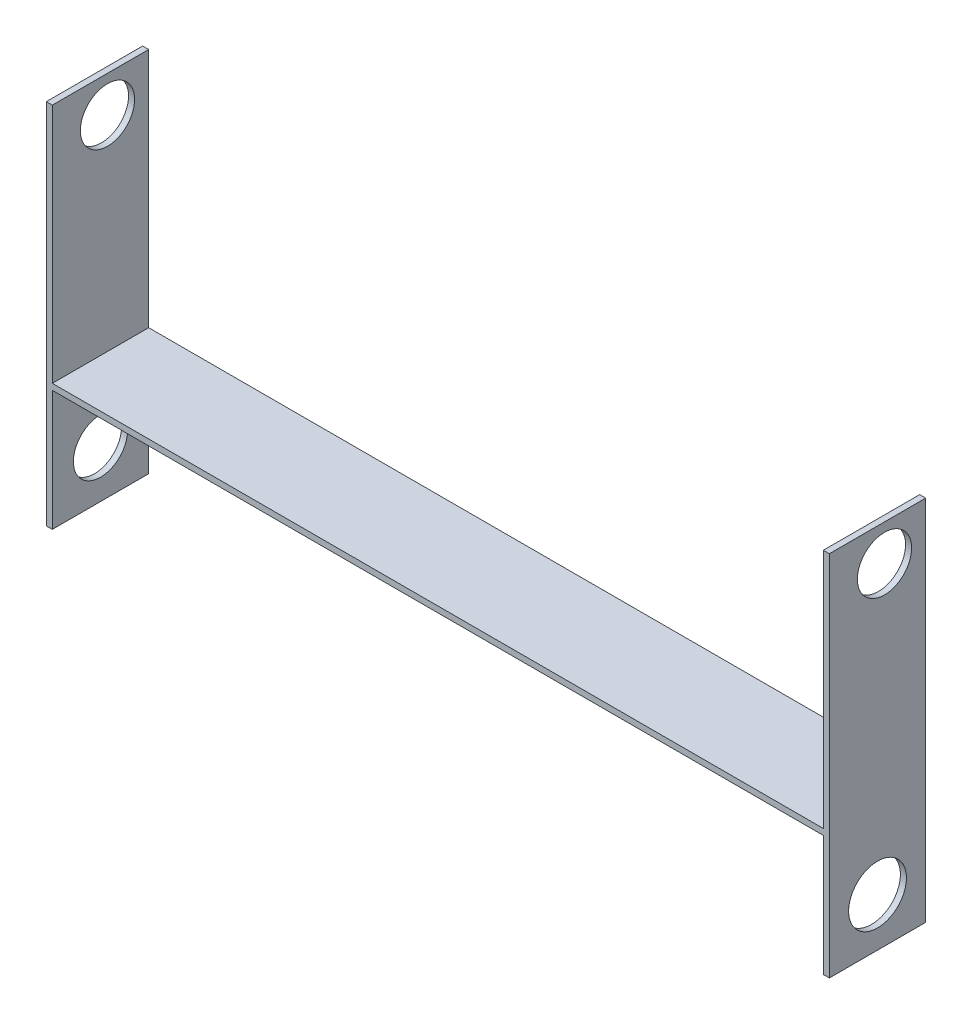
ISO-10303-21;
HEADER;
FILE_DESCRIPTION(('STEP AP214'),'2;1');
FILE_NAME('part.step','',(''),(''),'','','');
FILE_SCHEMA(('AUTOMOTIVE_DESIGN { 1 0 10303 214 1 1 1 1 }'));
ENDSEC;
DATA;
#1=APPLICATION_CONTEXT('core data for automotive mechanical design processes');
#2=APPLICATION_PROTOCOL_DEFINITION('international standard','automotive_design',2000,#1);
#3=PRODUCT_CONTEXT('',#1,'mechanical');
#4=PRODUCT('Part','Part','',(#3));
#5=PRODUCT_RELATED_PRODUCT_CATEGORY('part','',(#4));
#6=PRODUCT_DEFINITION_FORMATION('','',#4);
#7=PRODUCT_DEFINITION_CONTEXT('part definition',#1,'design');
#8=PRODUCT_DEFINITION('design','',#6,#7);
#9=PRODUCT_DEFINITION_SHAPE('','',#8);
#10=(LENGTH_UNIT() NAMED_UNIT(*) SI_UNIT(.MILLI.,.METRE.));
#11=(NAMED_UNIT(*) PLANE_ANGLE_UNIT() SI_UNIT($,.RADIAN.));
#12=(NAMED_UNIT(*) SI_UNIT($,.STERADIAN.) SOLID_ANGLE_UNIT());
#13=UNCERTAINTY_MEASURE_WITH_UNIT(LENGTH_MEASURE(1.E-05),#10,'distance_accuracy_value','');
#14=(GEOMETRIC_REPRESENTATION_CONTEXT(3) GLOBAL_UNCERTAINTY_ASSIGNED_CONTEXT((#13)) GLOBAL_UNIT_ASSIGNED_CONTEXT((#10,
#11,#12)) REPRESENTATION_CONTEXT('',''));
#15=CARTESIAN_POINT('',(0.,0.,0.));
#16=DIRECTION('',(0.,0.,1.));
#17=DIRECTION('',(1.,0.,0.));
#18=AXIS2_PLACEMENT_3D('',#15,#16,#17);
#19=CARTESIAN_POINT('',(-412.75,0.,50.8));
#20=DIRECTION('',(0.,1.,0.));
#21=DIRECTION('',(0.,0.,1.));
#22=AXIS2_PLACEMENT_3D('',#19,#20,#21);
#23=PLANE('',#22);
#24=DIRECTION('',(1.,0.,0.));
#25=VECTOR('',#24,1.);
#26=CARTESIAN_POINT('',(-412.75,0.,0.));
#27=LINE('',#26,#25);
#28=CARTESIAN_POINT('',(-409.575,0.,0.));
#29=VERTEX_POINT('',#28);
#30=CARTESIAN_POINT('',(-3.17500000000009,0.,0.));
#31=VERTEX_POINT('',#30);
#32=EDGE_CURVE('E52',#29,#31,#27,.T.);
#33=ORIENTED_EDGE('',*,*,#32,.T.);
#34=DIRECTION('',(0.,0.,1.));
#35=VECTOR('',#34,1.);
#36=CARTESIAN_POINT('',(-3.175,0.,50.8));
#37=LINE('',#36,#35);
#38=CARTESIAN_POINT('',(-3.17500000000009,0.,50.8));
#39=VERTEX_POINT('',#38);
#40=EDGE_CURVE('E47',#31,#39,#37,.T.);
#41=ORIENTED_EDGE('',*,*,#40,.T.);
#42=DIRECTION('',(1.,0.,0.));
#43=VECTOR('',#42,1.);
#44=CARTESIAN_POINT('',(-412.75,0.,50.8));
#45=LINE('',#44,#43);
#46=CARTESIAN_POINT('',(-409.575,0.,50.8));
#47=VERTEX_POINT('',#46);
#48=EDGE_CURVE('E142',#47,#39,#45,.T.);
#49=ORIENTED_EDGE('',*,*,#48,.F.);
#50=DIRECTION('',(0.,0.,-1.));
#51=VECTOR('',#50,1.);
#52=CARTESIAN_POINT('',(-409.575,0.,0.));
#53=LINE('',#52,#51);
#54=EDGE_CURVE('E166',#47,#29,#53,.T.);
#55=ORIENTED_EDGE('',*,*,#54,.T.);
#56=EDGE_LOOP('',(#33,#41,#49,#55));
#57=FACE_BOUND('',#56,.T.);
#58=ADVANCED_FACE('F32',(#57),#23,.F.);
#59=CARTESIAN_POINT('',(0.,0.,50.8));
#60=DIRECTION('',(-1.,0.,0.));
#61=DIRECTION('',(0.,0.,1.));
#62=AXIS2_PLACEMENT_3D('',#59,#60,#61);
#63=PLANE('',#62);
#64=CARTESIAN_POINT('',(0.,111.125,21.7297));
#65=DIRECTION('',(1.,0.,0.));
#66=DIRECTION('',(0.,0.,-1.));
#67=AXIS2_PLACEMENT_3D('',#64,#65,#66);
#68=CIRCLE('',#67,14.2875);
#69=CARTESIAN_POINT('',(0.,111.125,7.44220000000001));
#70=VERTEX_POINT('',#69);
#71=EDGE_CURVE('E316',#70,#70,#68,.T.);
#72=ORIENTED_EDGE('',*,*,#71,.F.);
#73=EDGE_LOOP('',(#72));
#74=FACE_BOUND('',#73,.T.);
#75=DIRECTION('',(0.,1.,0.));
#76=VECTOR('',#75,1.);
#77=CARTESIAN_POINT('',(0.,0.,0.));
#78=LINE('',#77,#76);
#79=CARTESIAN_POINT('',(0.,-63.5,0.));
#80=VERTEX_POINT('',#79);
#81=CARTESIAN_POINT('',(0.,130.175,0.));
#82=VERTEX_POINT('',#81);
#83=EDGE_CURVE('E194',#80,#82,#78,.T.);
#84=ORIENTED_EDGE('',*,*,#83,.T.);
#85=DIRECTION('',(0.,0.,-1.));
#86=VECTOR('',#85,1.);
#87=CARTESIAN_POINT('',(0.,130.175,50.8));
#88=LINE('',#87,#86);
#89=CARTESIAN_POINT('',(0.,130.175,50.8));
#90=VERTEX_POINT('',#89);
#91=EDGE_CURVE('E11',#90,#82,#88,.T.);
#92=ORIENTED_EDGE('',*,*,#91,.F.);
#93=DIRECTION('',(0.,1.,0.));
#94=VECTOR('',#93,1.);
#95=CARTESIAN_POINT('',(0.,0.,50.8));
#96=LINE('',#95,#94);
#97=CARTESIAN_POINT('',(0.,-63.5,50.8));
#98=VERTEX_POINT('',#97);
#99=EDGE_CURVE('E177',#98,#90,#96,.T.);
#100=ORIENTED_EDGE('',*,*,#99,.F.);
#101=DIRECTION('',(0.,0.,-1.));
#102=VECTOR('',#101,1.);
#103=CARTESIAN_POINT('',(0.,-63.5,0.));
#104=LINE('',#103,#102);
#105=EDGE_CURVE('E129',#98,#80,#104,.T.);
#106=ORIENTED_EDGE('',*,*,#105,.T.);
#107=EDGE_LOOP('',(#84,#92,#100,#106));
#108=FACE_BOUND('',#107,.T.);
#109=CARTESIAN_POINT('',(0.,-38.1,25.4));
#110=DIRECTION('',(1.,0.,0.));
#111=DIRECTION('',(0.,0.,-1.));
#112=AXIS2_PLACEMENT_3D('',#109,#110,#111);
#113=CIRCLE('',#112,15.24);
#114=CARTESIAN_POINT('',(0.,-38.1,10.16));
#115=VERTEX_POINT('',#114);
#116=EDGE_CURVE('E320',#115,#115,#113,.T.);
#117=ORIENTED_EDGE('',*,*,#116,.F.);
#118=EDGE_LOOP('',(#117));
#119=FACE_BOUND('',#118,.T.);
#120=ADVANCED_FACE('F246',(#74,#108,#119),#63,.F.);
#121=CARTESIAN_POINT('',(0.,130.175,50.8));
#122=DIRECTION('',(0.,-1.,0.));
#123=DIRECTION('',(0.,0.,-1.));
#124=AXIS2_PLACEMENT_3D('',#121,#122,#123);
#125=PLANE('',#124);
#126=DIRECTION('',(-1.,0.,0.));
#127=VECTOR('',#126,1.);
#128=CARTESIAN_POINT('',(0.,130.175,0.));
#129=LINE('',#128,#127);
#130=CARTESIAN_POINT('',(-3.17500000000001,130.175,0.));
#131=VERTEX_POINT('',#130);
#132=EDGE_CURVE('E196',#82,#131,#129,.T.);
#133=ORIENTED_EDGE('',*,*,#132,.T.);
#134=DIRECTION('',(0.,0.,-1.));
#135=VECTOR('',#134,1.);
#136=CARTESIAN_POINT('',(-3.17500000000001,130.175,50.8));
#137=LINE('',#136,#135);
#138=CARTESIAN_POINT('',(-3.17500000000001,130.175,50.8));
#139=VERTEX_POINT('',#138);
#140=EDGE_CURVE('E40',#139,#131,#137,.T.);
#141=ORIENTED_EDGE('',*,*,#140,.F.);
#142=DIRECTION('',(-1.,0.,0.));
#143=VECTOR('',#142,1.);
#144=CARTESIAN_POINT('',(0.,130.175,50.8));
#145=LINE('',#144,#143);
#146=EDGE_CURVE('E180',#90,#139,#145,.T.);
#147=ORIENTED_EDGE('',*,*,#146,.F.);
#148=ORIENTED_EDGE('',*,*,#91,.T.);
#149=EDGE_LOOP('',(#133,#141,#147,#148));
#150=FACE_BOUND('',#149,.T.);
#151=ADVANCED_FACE('F244',(#150),#125,.F.);
#152=CARTESIAN_POINT('',(-3.17500000000001,130.175,50.8));
#153=DIRECTION('',(1.,0.,0.));
#154=DIRECTION('',(0.,1.,0.));
#155=AXIS2_PLACEMENT_3D('',#152,#153,#154);
#156=PLANE('',#155);
#157=CARTESIAN_POINT('',(-3.17500000000004,111.125,21.7297));
#158=DIRECTION('',(1.,0.,0.));
#159=DIRECTION('',(0.,1.,0.));
#160=AXIS2_PLACEMENT_3D('',#157,#158,#159);
#161=CIRCLE('',#160,14.2875);
#162=CARTESIAN_POINT('',(-3.17500000000004,125.4125,21.7297));
#163=VERTEX_POINT('',#162);
#164=EDGE_CURVE('E319',#163,#163,#161,.T.);
#165=ORIENTED_EDGE('',*,*,#164,.T.);
#166=EDGE_LOOP('',(#165));
#167=FACE_BOUND('',#166,.T.);
#168=DIRECTION('',(0.,-1.,0.));
#169=VECTOR('',#168,1.);
#170=CARTESIAN_POINT('',(-3.17500000000001,130.175,0.));
#171=LINE('',#170,#169);
#172=CARTESIAN_POINT('',(-3.17499999999999,3.175,0.));
#173=VERTEX_POINT('',#172);
#174=EDGE_CURVE('E198',#131,#173,#171,.T.);
#175=ORIENTED_EDGE('',*,*,#174,.T.);
#176=DIRECTION('',(0.,0.,-1.));
#177=VECTOR('',#176,1.);
#178=CARTESIAN_POINT('',(-3.17499999999999,3.175,50.8));
#179=LINE('',#178,#177);
#180=CARTESIAN_POINT('',(-3.17499999999999,3.175,50.8));
#181=VERTEX_POINT('',#180);
#182=EDGE_CURVE('E215',#181,#173,#179,.T.);
#183=ORIENTED_EDGE('',*,*,#182,.F.);
#184=DIRECTION('',(0.,-1.,0.));
#185=VECTOR('',#184,1.);
#186=CARTESIAN_POINT('',(-3.17500000000001,130.175,50.8));
#187=LINE('',#186,#185);
#188=EDGE_CURVE('E182',#139,#181,#187,.T.);
#189=ORIENTED_EDGE('',*,*,#188,.F.);
#190=ORIENTED_EDGE('',*,*,#140,.T.);
#191=EDGE_LOOP('',(#175,#183,#189,#190));
#192=FACE_BOUND('',#191,.T.);
#193=ADVANCED_FACE('F223',(#167,#192),#156,.F.);
#194=CARTESIAN_POINT('',(-3.17499999999999,3.175,50.8));
#195=DIRECTION('',(0.,-1.,0.));
#196=DIRECTION('',(1.,0.,0.));
#197=AXIS2_PLACEMENT_3D('',#194,#195,#196);
#198=PLANE('',#197);
#199=DIRECTION('',(-1.,0.,0.));
#200=VECTOR('',#199,1.);
#201=CARTESIAN_POINT('',(-3.17499999999999,3.175,0.));
#202=LINE('',#201,#200);
#203=CARTESIAN_POINT('',(-409.575,3.17499999999995,0.));
#204=VERTEX_POINT('',#203);
#205=EDGE_CURVE('E200',#173,#204,#202,.T.);
#206=ORIENTED_EDGE('',*,*,#205,.T.);
#207=DIRECTION('',(0.,0.,-1.));
#208=VECTOR('',#207,1.);
#209=CARTESIAN_POINT('',(-409.575,3.17499999999995,50.8));
#210=LINE('',#209,#208);
#211=CARTESIAN_POINT('',(-409.575,3.17499999999995,50.8));
#212=VERTEX_POINT('',#211);
#213=EDGE_CURVE('E212',#212,#204,#210,.T.);
#214=ORIENTED_EDGE('',*,*,#213,.F.);
#215=DIRECTION('',(-1.,0.,0.));
#216=VECTOR('',#215,1.);
#217=CARTESIAN_POINT('',(-3.17499999999999,3.175,50.8));
#218=LINE('',#217,#216);
#219=EDGE_CURVE('E184',#181,#212,#218,.T.);
#220=ORIENTED_EDGE('',*,*,#219,.F.);
#221=ORIENTED_EDGE('',*,*,#182,.T.);
#222=EDGE_LOOP('',(#206,#214,#220,#221));
#223=FACE_BOUND('',#222,.T.);
#224=ADVANCED_FACE('F235',(#223),#198,.F.);
#225=CARTESIAN_POINT('',(-409.575,3.17499999999995,50.8));
#226=DIRECTION('',(-1.,0.,0.));
#227=DIRECTION('',(0.,0.,1.));
#228=AXIS2_PLACEMENT_3D('',#225,#226,#227);
#229=PLANE('',#228);
#230=CARTESIAN_POINT('',(-409.575,111.125,21.7297));
#231=DIRECTION('',(-1.,0.,0.));
#232=DIRECTION('',(0.,0.,1.));
#233=AXIS2_PLACEMENT_3D('',#230,#231,#232);
#234=CIRCLE('',#233,14.2875);
#235=CARTESIAN_POINT('',(-409.575,111.125,36.0172));
#236=VERTEX_POINT('',#235);
#237=EDGE_CURVE('E321',#236,#236,#234,.T.);
#238=ORIENTED_EDGE('',*,*,#237,.T.);
#239=EDGE_LOOP('',(#238));
#240=FACE_BOUND('',#239,.T.);
#241=DIRECTION('',(0.,1.,0.));
#242=VECTOR('',#241,1.);
#243=CARTESIAN_POINT('',(-409.575,3.17499999999995,0.));
#244=LINE('',#243,#242);
#245=CARTESIAN_POINT('',(-409.575,130.175,0.));
#246=VERTEX_POINT('',#245);
#247=EDGE_CURVE('E202',#204,#246,#244,.T.);
#248=ORIENTED_EDGE('',*,*,#247,.T.);
#249=DIRECTION('',(0.,0.,-1.));
#250=VECTOR('',#249,1.);
#251=CARTESIAN_POINT('',(-409.575,130.175,50.8));
#252=LINE('',#251,#250);
#253=CARTESIAN_POINT('',(-409.575,130.175,50.8));
#254=VERTEX_POINT('',#253);
#255=EDGE_CURVE('E209',#254,#246,#252,.T.);
#256=ORIENTED_EDGE('',*,*,#255,.F.);
#257=DIRECTION('',(0.,1.,0.));
#258=VECTOR('',#257,1.);
#259=CARTESIAN_POINT('',(-409.575,3.17499999999995,50.8));
#260=LINE('',#259,#258);
#261=EDGE_CURVE('E186',#212,#254,#260,.T.);
#262=ORIENTED_EDGE('',*,*,#261,.F.);
#263=ORIENTED_EDGE('',*,*,#213,.T.);
#264=EDGE_LOOP('',(#248,#256,#262,#263));
#265=FACE_BOUND('',#264,.T.);
#266=ADVANCED_FACE('F239',(#240,#265),#229,.F.);
#267=CARTESIAN_POINT('',(-409.575,130.175,50.8));
#268=DIRECTION('',(0.,-1.,0.));
#269=DIRECTION('',(0.,0.,-1.));
#270=AXIS2_PLACEMENT_3D('',#267,#268,#269);
#271=PLANE('',#270);
#272=DIRECTION('',(-1.,0.,0.));
#273=VECTOR('',#272,1.);
#274=CARTESIAN_POINT('',(-409.575,130.175,0.));
#275=LINE('',#274,#273);
#276=CARTESIAN_POINT('',(-412.75,130.175,0.));
#277=VERTEX_POINT('',#276);
#278=EDGE_CURVE('E204',#246,#277,#275,.T.);
#279=ORIENTED_EDGE('',*,*,#278,.T.);
#280=DIRECTION('',(0.,0.,-1.));
#281=VECTOR('',#280,1.);
#282=CARTESIAN_POINT('',(-412.75,130.175,50.8));
#283=LINE('',#282,#281);
#284=CARTESIAN_POINT('',(-412.75,130.175,50.8));
#285=VERTEX_POINT('',#284);
#286=EDGE_CURVE('E192',#285,#277,#283,.T.);
#287=ORIENTED_EDGE('',*,*,#286,.F.);
#288=DIRECTION('',(-1.,0.,0.));
#289=VECTOR('',#288,1.);
#290=CARTESIAN_POINT('',(-409.575,130.175,50.8));
#291=LINE('',#290,#289);
#292=EDGE_CURVE('E188',#254,#285,#291,.T.);
#293=ORIENTED_EDGE('',*,*,#292,.F.);
#294=ORIENTED_EDGE('',*,*,#255,.T.);
#295=EDGE_LOOP('',(#279,#287,#293,#294));
#296=FACE_BOUND('',#295,.T.);
#297=ADVANCED_FACE('F273',(#296),#271,.F.);
#298=CARTESIAN_POINT('',(-412.75,130.175,50.8));
#299=DIRECTION('',(1.,0.,0.));
#300=DIRECTION('',(0.,0.,-1.));
#301=AXIS2_PLACEMENT_3D('',#298,#299,#300);
#302=PLANE('',#301);
#303=CARTESIAN_POINT('',(-412.75,111.125,21.7297));
#304=DIRECTION('',(1.,0.,0.));
#305=DIRECTION('',(0.,0.,-1.));
#306=AXIS2_PLACEMENT_3D('',#303,#304,#305);
#307=CIRCLE('',#306,14.2875);
#308=CARTESIAN_POINT('',(-412.75,111.125,7.44220000000001));
#309=VERTEX_POINT('',#308);
#310=EDGE_CURVE('E35',#309,#309,#307,.T.);
#311=ORIENTED_EDGE('',*,*,#310,.T.);
#312=EDGE_LOOP('',(#311));
#313=FACE_BOUND('',#312,.T.);
#314=DIRECTION('',(0.,-1.,0.));
#315=VECTOR('',#314,1.);
#316=CARTESIAN_POINT('',(-412.75,130.175,0.));
#317=LINE('',#316,#315);
#318=CARTESIAN_POINT('',(-412.75,-63.5,0.));
#319=VERTEX_POINT('',#318);
#320=EDGE_CURVE('E178',#277,#319,#317,.T.);
#321=ORIENTED_EDGE('',*,*,#320,.T.);
#322=DIRECTION('',(0.,0.,1.));
#323=VECTOR('',#322,1.);
#324=CARTESIAN_POINT('',(-412.75,-63.5,0.));
#325=LINE('',#324,#323);
#326=CARTESIAN_POINT('',(-412.75,-63.5,50.8));
#327=VERTEX_POINT('',#326);
#328=EDGE_CURVE('E155',#319,#327,#325,.T.);
#329=ORIENTED_EDGE('',*,*,#328,.T.);
#330=DIRECTION('',(0.,-1.,0.));
#331=VECTOR('',#330,1.);
#332=CARTESIAN_POINT('',(-412.75,130.175,50.8));
#333=LINE('',#332,#331);
#334=EDGE_CURVE('E190',#285,#327,#333,.T.);
#335=ORIENTED_EDGE('',*,*,#334,.F.);
#336=ORIENTED_EDGE('',*,*,#286,.T.);
#337=EDGE_LOOP('',(#321,#329,#335,#336));
#338=FACE_BOUND('',#337,.T.);
#339=CARTESIAN_POINT('',(-412.75,-38.1,25.4));
#340=DIRECTION('',(-1.,0.,0.));
#341=DIRECTION('',(0.,0.,1.));
#342=AXIS2_PLACEMENT_3D('',#339,#340,#341);
#343=CIRCLE('',#342,14.2875);
#344=CARTESIAN_POINT('',(-412.75,-38.1,39.6875));
#345=VERTEX_POINT('',#344);
#346=EDGE_CURVE('E150',#345,#345,#343,.T.);
#347=ORIENTED_EDGE('',*,*,#346,.F.);
#348=EDGE_LOOP('',(#347));
#349=FACE_BOUND('',#348,.T.);
#350=ADVANCED_FACE('F277',(#313,#338,#349),#302,.F.);
#351=CARTESIAN_POINT('',(0.,0.,50.8));
#352=DIRECTION('',(0.,0.,1.));
#353=DIRECTION('',(1.,0.,0.));
#354=AXIS2_PLACEMENT_3D('',#351,#352,#353);
#355=PLANE('',#354);
#356=ORIENTED_EDGE('',*,*,#334,.T.);
#357=DIRECTION('',(-1.,0.,0.));
#358=VECTOR('',#357,1.);
#359=CARTESIAN_POINT('',(-409.575,-63.5,50.8));
#360=LINE('',#359,#358);
#361=CARTESIAN_POINT('',(-409.575,-63.5,50.8));
#362=VERTEX_POINT('',#361);
#363=EDGE_CURVE('E171',#362,#327,#360,.T.);
#364=ORIENTED_EDGE('',*,*,#363,.F.);
#365=DIRECTION('',(0.,1.,0.));
#366=VECTOR('',#365,1.);
#367=CARTESIAN_POINT('',(-409.575,0.,50.8));
#368=LINE('',#367,#366);
#369=EDGE_CURVE('E164',#362,#47,#368,.T.);
#370=ORIENTED_EDGE('',*,*,#369,.T.);
#371=ORIENTED_EDGE('',*,*,#48,.T.);
#372=DIRECTION('',(0.,-1.,0.));
#373=VECTOR('',#372,1.);
#374=CARTESIAN_POINT('',(-3.175,-63.5,50.8));
#375=LINE('',#374,#373);
#376=CARTESIAN_POINT('',(-3.175,-63.5,50.8));
#377=VERTEX_POINT('',#376);
#378=EDGE_CURVE('E138',#39,#377,#375,.T.);
#379=ORIENTED_EDGE('',*,*,#378,.T.);
#380=DIRECTION('',(1.,0.,0.));
#381=VECTOR('',#380,1.);
#382=CARTESIAN_POINT('',(-3.175,-63.5,50.8));
#383=LINE('',#382,#381);
#384=EDGE_CURVE('E122',#377,#98,#383,.T.);
#385=ORIENTED_EDGE('',*,*,#384,.T.);
#386=ORIENTED_EDGE('',*,*,#99,.T.);
#387=ORIENTED_EDGE('',*,*,#146,.T.);
#388=ORIENTED_EDGE('',*,*,#188,.T.);
#389=ORIENTED_EDGE('',*,*,#219,.T.);
#390=ORIENTED_EDGE('',*,*,#261,.T.);
#391=ORIENTED_EDGE('',*,*,#292,.T.);
#392=EDGE_LOOP('',(#356,#364,#370,#371,#379,#385,#386,#387,#388,#389,#390,#391));
#393=FACE_BOUND('',#392,.T.);
#394=ADVANCED_FACE('F141',(#393),#355,.T.);
#395=CARTESIAN_POINT('',(0.,0.,0.));
#396=DIRECTION('',(0.,0.,1.));
#397=DIRECTION('',(1.,0.,0.));
#398=AXIS2_PLACEMENT_3D('',#395,#396,#397);
#399=PLANE('',#398);
#400=ORIENTED_EDGE('',*,*,#32,.F.);
#401=DIRECTION('',(0.,-1.,0.));
#402=VECTOR('',#401,1.);
#403=CARTESIAN_POINT('',(-409.575,0.,0.));
#404=LINE('',#403,#402);
#405=CARTESIAN_POINT('',(-409.575,-63.5,0.));
#406=VERTEX_POINT('',#405);
#407=EDGE_CURVE('E158',#29,#406,#404,.T.);
#408=ORIENTED_EDGE('',*,*,#407,.T.);
#409=DIRECTION('',(-1.,0.,0.));
#410=VECTOR('',#409,1.);
#411=CARTESIAN_POINT('',(-409.575,-63.5,0.));
#412=LINE('',#411,#410);
#413=EDGE_CURVE('E168',#406,#319,#412,.T.);
#414=ORIENTED_EDGE('',*,*,#413,.T.);
#415=ORIENTED_EDGE('',*,*,#320,.F.);
#416=ORIENTED_EDGE('',*,*,#278,.F.);
#417=ORIENTED_EDGE('',*,*,#247,.F.);
#418=ORIENTED_EDGE('',*,*,#205,.F.);
#419=ORIENTED_EDGE('',*,*,#174,.F.);
#420=ORIENTED_EDGE('',*,*,#132,.F.);
#421=ORIENTED_EDGE('',*,*,#83,.F.);
#422=DIRECTION('',(1.,0.,0.));
#423=VECTOR('',#422,1.);
#424=CARTESIAN_POINT('',(-3.175,-63.5,0.));
#425=LINE('',#424,#423);
#426=CARTESIAN_POINT('',(-3.175,-63.5,0.));
#427=VERTEX_POINT('',#426);
#428=EDGE_CURVE('E132',#427,#80,#425,.T.);
#429=ORIENTED_EDGE('',*,*,#428,.F.);
#430=DIRECTION('',(0.,1.,0.));
#431=VECTOR('',#430,1.);
#432=CARTESIAN_POINT('',(-3.175,0.,0.));
#433=LINE('',#432,#431);
#434=EDGE_CURVE('E133',#427,#31,#433,.T.);
#435=ORIENTED_EDGE('',*,*,#434,.T.);
#436=EDGE_LOOP('',(#400,#408,#414,#415,#416,#417,#418,#419,#420,#421,#429,#435));
#437=FACE_BOUND('',#436,.T.);
#438=ADVANCED_FACE('F230',(#437),#399,.F.);
#439=CARTESIAN_POINT('',(-409.575,-63.5,0.));
#440=DIRECTION('',(0.,-1.,0.));
#441=DIRECTION('',(0.,0.,-1.));
#442=AXIS2_PLACEMENT_3D('',#439,#440,#441);
#443=PLANE('',#442);
#444=ORIENTED_EDGE('',*,*,#328,.F.);
#445=ORIENTED_EDGE('',*,*,#413,.F.);
#446=DIRECTION('',(0.,0.,1.));
#447=VECTOR('',#446,1.);
#448=CARTESIAN_POINT('',(-409.575,-63.5,0.));
#449=LINE('',#448,#447);
#450=EDGE_CURVE('E161',#406,#362,#449,.T.);
#451=ORIENTED_EDGE('',*,*,#450,.T.);
#452=ORIENTED_EDGE('',*,*,#363,.T.);
#453=EDGE_LOOP('',(#444,#445,#451,#452));
#454=FACE_BOUND('',#453,.T.);
#455=ADVANCED_FACE('F284',(#454),#443,.T.);
#456=CARTESIAN_POINT('',(-409.575,0.,0.));
#457=DIRECTION('',(-1.,0.,0.));
#458=DIRECTION('',(0.,0.,1.));
#459=AXIS2_PLACEMENT_3D('',#456,#457,#458);
#460=PLANE('',#459);
#461=CARTESIAN_POINT('',(-409.575,-38.1,25.4));
#462=DIRECTION('',(-1.,0.,0.));
#463=DIRECTION('',(0.,0.,1.));
#464=AXIS2_PLACEMENT_3D('',#461,#462,#463);
#465=CIRCLE('',#464,14.2875);
#466=CARTESIAN_POINT('',(-409.575,-38.1,39.6875));
#467=VERTEX_POINT('',#466);
#468=EDGE_CURVE('E152',#467,#467,#465,.T.);
#469=ORIENTED_EDGE('',*,*,#468,.T.);
#470=EDGE_LOOP('',(#469));
#471=FACE_BOUND('',#470,.T.);
#472=ORIENTED_EDGE('',*,*,#407,.F.);
#473=ORIENTED_EDGE('',*,*,#54,.F.);
#474=ORIENTED_EDGE('',*,*,#369,.F.);
#475=ORIENTED_EDGE('',*,*,#450,.F.);
#476=EDGE_LOOP('',(#472,#473,#474,#475));
#477=FACE_BOUND('',#476,.T.);
#478=ADVANCED_FACE('F253',(#471,#477),#460,.F.);
#479=CARTESIAN_POINT('',(-409.575,-38.1,25.4));
#480=DIRECTION('',(-1.,0.,0.));
#481=DIRECTION('',(0.,0.,1.));
#482=AXIS2_PLACEMENT_3D('',#479,#480,#481);
#483=CYLINDRICAL_SURFACE('',#482,14.2875);
#484=ORIENTED_EDGE('',*,*,#468,.F.);
#485=EDGE_LOOP('',(#484));
#486=FACE_BOUND('',#485,.T.);
#487=ORIENTED_EDGE('',*,*,#346,.T.);
#488=EDGE_LOOP('',(#487));
#489=FACE_BOUND('',#488,.T.);
#490=ADVANCED_FACE('F292',(#486,#489),#483,.F.);
#491=CARTESIAN_POINT('',(-3.175,-63.5,0.));
#492=DIRECTION('',(0.,-1.,0.));
#493=DIRECTION('',(0.,0.,-1.));
#494=AXIS2_PLACEMENT_3D('',#491,#492,#493);
#495=PLANE('',#494);
#496=ORIENTED_EDGE('',*,*,#105,.F.);
#497=ORIENTED_EDGE('',*,*,#384,.F.);
#498=DIRECTION('',(0.,0.,-1.));
#499=VECTOR('',#498,1.);
#500=CARTESIAN_POINT('',(-3.175,-63.5,0.));
#501=LINE('',#500,#499);
#502=EDGE_CURVE('E126',#377,#427,#501,.T.);
#503=ORIENTED_EDGE('',*,*,#502,.T.);
#504=ORIENTED_EDGE('',*,*,#428,.T.);
#505=EDGE_LOOP('',(#496,#497,#503,#504));
#506=FACE_BOUND('',#505,.T.);
#507=ADVANCED_FACE('F124',(#506),#495,.T.);
#508=CARTESIAN_POINT('',(-3.175,0.,0.));
#509=DIRECTION('',(-1.,0.,0.));
#510=DIRECTION('',(0.,0.,1.));
#511=AXIS2_PLACEMENT_3D('',#508,#509,#510);
#512=PLANE('',#511);
#513=CARTESIAN_POINT('',(-3.175,-38.1,25.4));
#514=DIRECTION('',(1.,0.,0.));
#515=DIRECTION('',(0.,0.,-1.));
#516=AXIS2_PLACEMENT_3D('',#513,#514,#515);
#517=CIRCLE('',#516,15.24);
#518=CARTESIAN_POINT('',(-3.175,-38.1,10.16));
#519=VERTEX_POINT('',#518);
#520=EDGE_CURVE('E149',#519,#519,#517,.T.);
#521=ORIENTED_EDGE('',*,*,#520,.T.);
#522=EDGE_LOOP('',(#521));
#523=FACE_BOUND('',#522,.T.);
#524=ORIENTED_EDGE('',*,*,#40,.F.);
#525=ORIENTED_EDGE('',*,*,#434,.F.);
#526=ORIENTED_EDGE('',*,*,#502,.F.);
#527=ORIENTED_EDGE('',*,*,#378,.F.);
#528=EDGE_LOOP('',(#524,#525,#526,#527));
#529=FACE_BOUND('',#528,.T.);
#530=ADVANCED_FACE('F137',(#523,#529),#512,.T.);
#531=CARTESIAN_POINT('',(-3.175,-38.1,25.4));
#532=DIRECTION('',(1.,0.,0.));
#533=DIRECTION('',(0.,0.,-1.));
#534=AXIS2_PLACEMENT_3D('',#531,#532,#533);
#535=CYLINDRICAL_SURFACE('',#534,15.24);
#536=ORIENTED_EDGE('',*,*,#520,.F.);
#537=EDGE_LOOP('',(#536));
#538=FACE_BOUND('',#537,.T.);
#539=ORIENTED_EDGE('',*,*,#116,.T.);
#540=EDGE_LOOP('',(#539));
#541=FACE_BOUND('',#540,.T.);
#542=ADVANCED_FACE('F301',(#538,#541),#535,.F.);
#543=CARTESIAN_POINT('',(-508.,111.125,21.7297));
#544=DIRECTION('',(1.,0.,0.));
#545=DIRECTION('',(0.,0.,-1.));
#546=AXIS2_PLACEMENT_3D('',#543,#544,#545);
#547=CYLINDRICAL_SURFACE('',#546,14.2875);
#548=ORIENTED_EDGE('',*,*,#310,.F.);
#549=EDGE_LOOP('',(#548));
#550=FACE_BOUND('',#549,.T.);
#551=ORIENTED_EDGE('',*,*,#237,.F.);
#552=EDGE_LOOP('',(#551));
#553=FACE_BOUND('',#552,.T.);
#554=ADVANCED_FACE('F305',(#550,#553),#547,.F.);
#555=ORIENTED_EDGE('',*,*,#71,.T.);
#556=EDGE_LOOP('',(#555));
#557=FACE_BOUND('',#556,.T.);
#558=ORIENTED_EDGE('',*,*,#164,.F.);
#559=EDGE_LOOP('',(#558));
#560=FACE_BOUND('',#559,.T.);
#561=ADVANCED_FACE('F307',(#557,#560),#547,.F.);
#562=CLOSED_SHELL('',(#58,#120,#151,#193,#224,#266,#297,#350,#394,#438,#455,#478,#490,#507,#530,
#542,#554,#561));
#563=MANIFOLD_SOLID_BREP('B2',#562);
#564=ADVANCED_BREP_SHAPE_REPRESENTATION('',(#18,#563),#14);
#565=SHAPE_DEFINITION_REPRESENTATION(#9,#564);
ENDSEC;
END-ISO-10303-21;
